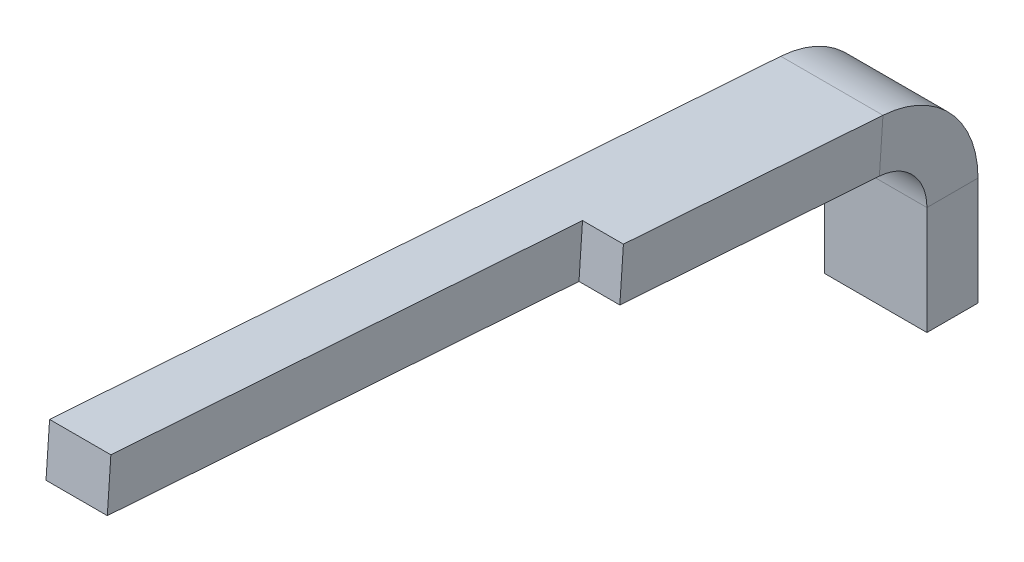
ISO-10303-21;
HEADER;
FILE_DESCRIPTION(('STEP AP214'),'2;1');
FILE_NAME('part.step','',(''),(''),'','','');
FILE_SCHEMA(('AUTOMOTIVE_DESIGN { 1 0 10303 214 1 1 1 1 }'));
ENDSEC;
DATA;
#1=APPLICATION_CONTEXT('core data for automotive mechanical design processes');
#2=APPLICATION_PROTOCOL_DEFINITION('international standard','automotive_design',2000,#1);
#3=PRODUCT_CONTEXT('',#1,'mechanical');
#4=PRODUCT('Part','Part','',(#3));
#5=PRODUCT_RELATED_PRODUCT_CATEGORY('part','',(#4));
#6=PRODUCT_DEFINITION_FORMATION('','',#4);
#7=PRODUCT_DEFINITION_CONTEXT('part definition',#1,'design');
#8=PRODUCT_DEFINITION('design','',#6,#7);
#9=PRODUCT_DEFINITION_SHAPE('','',#8);
#10=(LENGTH_UNIT() NAMED_UNIT(*) SI_UNIT(.MILLI.,.METRE.));
#11=(NAMED_UNIT(*) PLANE_ANGLE_UNIT() SI_UNIT($,.RADIAN.));
#12=(NAMED_UNIT(*) SI_UNIT($,.STERADIAN.) SOLID_ANGLE_UNIT());
#13=UNCERTAINTY_MEASURE_WITH_UNIT(LENGTH_MEASURE(1.E-05),#10,'distance_accuracy_value','');
#14=(GEOMETRIC_REPRESENTATION_CONTEXT(3) GLOBAL_UNCERTAINTY_ASSIGNED_CONTEXT((#13)) GLOBAL_UNIT_ASSIGNED_CONTEXT((#10,
#11,#12)) REPRESENTATION_CONTEXT('',''));
#15=CARTESIAN_POINT('',(0.,0.,0.));
#16=DIRECTION('',(0.,0.,1.));
#17=DIRECTION('',(1.,0.,0.));
#18=AXIS2_PLACEMENT_3D('',#15,#16,#17);
#19=CARTESIAN_POINT('',(0.,0.,0.5));
#20=DIRECTION('',(0.,0.,1.));
#21=DIRECTION('',(1.,0.,0.));
#22=AXIS2_PLACEMENT_3D('',#19,#20,#21);
#23=PLANE('',#22);
#24=DIRECTION('',(0.,1.,0.));
#25=VECTOR('',#24,1.);
#26=CARTESIAN_POINT('',(33.6102996083542,0.,0.5));
#27=LINE('',#26,#25);
#28=CARTESIAN_POINT('',(33.6102996083542,20.4586796564352,0.5));
#29=VERTEX_POINT('',#28);
#30=CARTESIAN_POINT('',(33.6102996083542,21.5182796564303,0.5));
#31=VERTEX_POINT('',#30);
#32=EDGE_CURVE('E11',#29,#31,#27,.T.);
#33=ORIENTED_EDGE('',*,*,#32,.F.);
#34=DIRECTION('',(1.,0.,0.));
#35=VECTOR('',#34,1.);
#36=CARTESIAN_POINT('',(0.,20.4586796564352,0.5));
#37=LINE('',#36,#35);
#38=CARTESIAN_POINT('',(34.6102996083542,20.4586796564352,0.5));
#39=VERTEX_POINT('',#38);
#40=EDGE_CURVE('E24',#29,#39,#37,.T.);
#41=ORIENTED_EDGE('',*,*,#40,.T.);
#42=DIRECTION('',(0.,1.,0.));
#43=VECTOR('',#42,1.);
#44=CARTESIAN_POINT('',(34.6102996083542,0.,0.5));
#45=LINE('',#44,#43);
#46=CARTESIAN_POINT('',(34.6102996083542,21.5182796564303,0.5));
#47=VERTEX_POINT('',#46);
#48=EDGE_CURVE('E172',#39,#47,#45,.T.);
#49=ORIENTED_EDGE('',*,*,#48,.T.);
#50=DIRECTION('',(-1.,0.,0.));
#51=VECTOR('',#50,1.);
#52=CARTESIAN_POINT('',(0.,21.5182796564303,0.5));
#53=LINE('',#52,#51);
#54=EDGE_CURVE('E170',#47,#31,#53,.T.);
#55=ORIENTED_EDGE('',*,*,#54,.T.);
#56=EDGE_LOOP('',(#33,#41,#49,#55));
#57=FACE_BOUND('',#56,.T.);
#58=ADVANCED_FACE('F17',(#57),#23,.T.);
#59=CARTESIAN_POINT('',(33.6102996083542,0.,0.5));
#60=DIRECTION('',(-1.,0.,0.));
#61=DIRECTION('',(0.,0.,1.));
#62=AXIS2_PLACEMENT_3D('',#59,#60,#61);
#63=PLANE('',#62);
#64=DIRECTION('',(0.,1.,0.));
#65=VECTOR('',#64,1.);
#66=CARTESIAN_POINT('',(33.6102996083542,0.,0.));
#67=LINE('',#66,#65);
#68=CARTESIAN_POINT('',(33.6102996083542,20.4586796564352,0.));
#69=VERTEX_POINT('',#68);
#70=CARTESIAN_POINT('',(33.6102996083542,21.5182796564303,0.));
#71=VERTEX_POINT('',#70);
#72=EDGE_CURVE('E168',#69,#71,#67,.T.);
#73=ORIENTED_EDGE('',*,*,#72,.F.);
#74=DIRECTION('',(0.,0.,1.));
#75=VECTOR('',#74,1.);
#76=CARTESIAN_POINT('',(33.6102996083542,20.4586796564352,0.5));
#77=LINE('',#76,#75);
#78=EDGE_CURVE('E166',#69,#29,#77,.T.);
#79=ORIENTED_EDGE('',*,*,#78,.T.);
#80=ORIENTED_EDGE('',*,*,#32,.T.);
#81=DIRECTION('',(0.,0.,-1.));
#82=VECTOR('',#81,1.);
#83=CARTESIAN_POINT('',(33.6102996083542,21.5182796564303,0.50000000000015));
#84=LINE('',#83,#82);
#85=EDGE_CURVE('E164',#31,#71,#84,.T.);
#86=ORIENTED_EDGE('',*,*,#85,.T.);
#87=EDGE_LOOP('',(#73,#79,#80,#86));
#88=FACE_BOUND('',#87,.T.);
#89=ADVANCED_FACE('F211',(#88),#63,.T.);
#90=CARTESIAN_POINT('',(0.,0.,0.));
#91=DIRECTION('',(0.,0.,1.));
#92=DIRECTION('',(1.,0.,0.));
#93=AXIS2_PLACEMENT_3D('',#90,#91,#92);
#94=PLANE('',#93);
#95=DIRECTION('',(1.,0.,0.));
#96=VECTOR('',#95,1.);
#97=CARTESIAN_POINT('',(0.,20.4586796564352,0.));
#98=LINE('',#97,#96);
#99=CARTESIAN_POINT('',(34.6102996083542,20.4586796564352,0.));
#100=VERTEX_POINT('',#99);
#101=EDGE_CURVE('E162',#69,#100,#98,.T.);
#102=ORIENTED_EDGE('',*,*,#101,.F.);
#103=ORIENTED_EDGE('',*,*,#72,.T.);
#104=DIRECTION('',(-1.,0.,0.));
#105=VECTOR('',#104,1.);
#106=CARTESIAN_POINT('',(0.,21.5182796564303,0.));
#107=LINE('',#106,#105);
#108=CARTESIAN_POINT('',(34.6102996083542,21.5182796564303,0.));
#109=VERTEX_POINT('',#108);
#110=EDGE_CURVE('E159',#109,#71,#107,.T.);
#111=ORIENTED_EDGE('',*,*,#110,.F.);
#112=DIRECTION('',(0.,1.,0.));
#113=VECTOR('',#112,1.);
#114=CARTESIAN_POINT('',(34.6102996083542,0.,0.));
#115=LINE('',#114,#113);
#116=EDGE_CURVE('E156',#100,#109,#115,.T.);
#117=ORIENTED_EDGE('',*,*,#116,.F.);
#118=EDGE_LOOP('',(#102,#103,#111,#117));
#119=FACE_BOUND('',#118,.T.);
#120=ADVANCED_FACE('F186',(#119),#94,.F.);
#121=CARTESIAN_POINT('',(34.6102996083542,0.,0.5));
#122=DIRECTION('',(-1.,0.,0.));
#123=DIRECTION('',(0.,0.,1.));
#124=AXIS2_PLACEMENT_3D('',#121,#122,#123);
#125=PLANE('',#124);
#126=DIRECTION('',(0.,0.,1.));
#127=VECTOR('',#126,1.);
#128=CARTESIAN_POINT('',(34.6102996083542,20.4586796564352,0.5));
#129=LINE('',#128,#127);
#130=EDGE_CURVE('E153',#100,#39,#129,.T.);
#131=ORIENTED_EDGE('',*,*,#130,.F.);
#132=ORIENTED_EDGE('',*,*,#116,.T.);
#133=DIRECTION('',(0.,0.,-1.));
#134=VECTOR('',#133,1.);
#135=CARTESIAN_POINT('',(34.6102996083542,21.5182796564303,0.50000000000015));
#136=LINE('',#135,#134);
#137=EDGE_CURVE('E150',#47,#109,#136,.T.);
#138=ORIENTED_EDGE('',*,*,#137,.F.);
#139=ORIENTED_EDGE('',*,*,#48,.F.);
#140=EDGE_LOOP('',(#131,#132,#138,#139));
#141=FACE_BOUND('',#140,.T.);
#142=ADVANCED_FACE('F180',(#141),#125,.F.);
#143=CARTESIAN_POINT('',(34.6102996083542,20.4374949025665,-21.6237355734527));
#144=DIRECTION('',(-1.,0.,0.));
#145=DIRECTION('',(0.,-0.997564050259825,0.0697564737441219));
#146=AXIS2_PLACEMENT_3D('',#143,#144,#145);
#147=PLANE('',#146);
#148=DIRECTION('',(0.,0.0697564737441219,0.997564050259824));
#149=VECTOR('',#148,1.);
#150=CARTESIAN_POINT('',(34.6102996083542,20.4374949025665,-21.6237355734527));
#151=LINE('',#150,#149);
#152=CARTESIAN_POINT('',(34.6102996083542,22.0170616815602,0.965121763127939));
#153=VERTEX_POINT('',#152);
#154=CARTESIAN_POINT('',(34.6102996083542,22.1947078866175,3.5055808534239));
#155=VERTEX_POINT('',#154);
#156=EDGE_CURVE('E109',#153,#155,#151,.T.);
#157=ORIENTED_EDGE('',*,*,#156,.F.);
#158=DIRECTION('',(0.,0.997564050259825,-0.069756473744115));
#159=VECTOR('',#158,1.);
#160=CARTESIAN_POINT('',(34.6102996083542,22.0170616815601,0.965121763127949));
#161=LINE('',#160,#159);
#162=CARTESIAN_POINT('',(34.6102996083542,22.5158437066902,0.93024352625588));
#163=VERTEX_POINT('',#162);
#164=EDGE_CURVE('E147',#153,#163,#161,.T.);
#165=ORIENTED_EDGE('',*,*,#164,.T.);
#166=DIRECTION('',(0.,0.0697564737441219,0.997564050259824));
#167=VECTOR('',#166,1.);
#168=CARTESIAN_POINT('',(34.6102996083542,20.9362769276964,-21.6586138103247));
#169=LINE('',#168,#167);
#170=CARTESIAN_POINT('',(34.6102996083542,22.6934899117475,3.4707026165519));
#171=VERTEX_POINT('',#170);
#172=EDGE_CURVE('E145',#163,#171,#169,.T.);
#173=ORIENTED_EDGE('',*,*,#172,.T.);
#174=DIRECTION('',(0.,0.997564050259824,-0.0697564737441219));
#175=VECTOR('',#174,1.);
#176=CARTESIAN_POINT('',(34.6102996083542,22.1947078866175,3.5055808534239));
#177=LINE('',#176,#175);
#178=EDGE_CURVE('E143',#155,#171,#177,.T.);
#179=ORIENTED_EDGE('',*,*,#178,.F.);
#180=EDGE_LOOP('',(#157,#165,#173,#179));
#181=FACE_BOUND('',#180,.T.);
#182=ADVANCED_FACE('F222',(#181),#147,.F.);
#183=CARTESIAN_POINT('',(0.,20.9362769276964,-21.6586138103247));
#184=DIRECTION('',(0.,-0.997564050259825,0.0697564737441219));
#185=DIRECTION('',(1.,0.,0.));
#186=AXIS2_PLACEMENT_3D('',#183,#184,#185);
#187=PLANE('',#186);
#188=ORIENTED_EDGE('',*,*,#172,.F.);
#189=DIRECTION('',(-1.,0.,0.));
#190=VECTOR('',#189,1.);
#191=CARTESIAN_POINT('',(0.,22.5158437066902,0.93024352625588));
#192=LINE('',#191,#190);
#193=CARTESIAN_POINT('',(33.6102996083542,22.5158437066902,0.93024352625588));
#194=VERTEX_POINT('',#193);
#195=EDGE_CURVE('E141',#163,#194,#192,.T.);
#196=ORIENTED_EDGE('',*,*,#195,.T.);
#197=DIRECTION('',(0.,0.0697564737441219,0.997564050259824));
#198=VECTOR('',#197,1.);
#199=CARTESIAN_POINT('',(33.6102996083542,20.9362769276964,-21.6586138103247));
#200=LINE('',#199,#198);
#201=CARTESIAN_POINT('',(33.6102996083542,23.0163228722701,8.0874290416525));
#202=VERTEX_POINT('',#201);
#203=EDGE_CURVE('E139',#194,#202,#200,.T.);
#204=ORIENTED_EDGE('',*,*,#203,.T.);
#205=DIRECTION('',(1.,0.,0.));
#206=VECTOR('',#205,1.);
#207=CARTESIAN_POINT('',(0.,23.0163228722701,8.0874290416525));
#208=LINE('',#207,#206);
#209=CARTESIAN_POINT('',(34.2102996083517,23.0163228722701,8.0874290416525));
#210=VERTEX_POINT('',#209);
#211=EDGE_CURVE('E137',#202,#210,#208,.T.);
#212=ORIENTED_EDGE('',*,*,#211,.T.);
#213=DIRECTION('',(0.,0.0697564737441219,0.997564050259824));
#214=VECTOR('',#213,1.);
#215=CARTESIAN_POINT('',(34.2102996083517,20.9362769276964,-21.6586138103247));
#216=LINE('',#215,#214);
#217=CARTESIAN_POINT('',(34.2102996083517,22.6934899117475,3.4707026165519));
#218=VERTEX_POINT('',#217);
#219=EDGE_CURVE('E135',#218,#210,#216,.T.);
#220=ORIENTED_EDGE('',*,*,#219,.F.);
#221=DIRECTION('',(1.,0.,0.));
#222=VECTOR('',#221,1.);
#223=CARTESIAN_POINT('',(0.,22.6934899117475,3.4707026165519));
#224=LINE('',#223,#222);
#225=EDGE_CURVE('E97',#218,#171,#224,.T.);
#226=ORIENTED_EDGE('',*,*,#225,.T.);
#227=EDGE_LOOP('',(#188,#196,#204,#212,#220,#226));
#228=FACE_BOUND('',#227,.T.);
#229=ADVANCED_FACE('F225',(#228),#187,.F.);
#230=CARTESIAN_POINT('',(0.,22.5175408471402,8.1223072785245));
#231=DIRECTION('',(0.,0.0697564737441219,0.997564050259825));
#232=DIRECTION('',(0.,-0.997564050259825,0.0697564737441219));
#233=AXIS2_PLACEMENT_3D('',#230,#231,#232);
#234=PLANE('',#233);
#235=ORIENTED_EDGE('',*,*,#211,.F.);
#236=DIRECTION('',(0.,0.997564050259824,-0.0697564737441219));
#237=VECTOR('',#236,1.);
#238=CARTESIAN_POINT('',(33.6102996083542,22.5175408471402,8.1223072785245));
#239=LINE('',#238,#237);
#240=CARTESIAN_POINT('',(33.6102996083542,22.5175408471402,8.1223072785245));
#241=VERTEX_POINT('',#240);
#242=EDGE_CURVE('E131',#241,#202,#239,.T.);
#243=ORIENTED_EDGE('',*,*,#242,.F.);
#244=DIRECTION('',(1.,0.,0.));
#245=VECTOR('',#244,1.);
#246=CARTESIAN_POINT('',(0.,22.5175408471402,8.1223072785245));
#247=LINE('',#246,#245);
#248=CARTESIAN_POINT('',(34.2102996083517,22.5175408471402,8.1223072785245));
#249=VERTEX_POINT('',#248);
#250=EDGE_CURVE('E129',#241,#249,#247,.T.);
#251=ORIENTED_EDGE('',*,*,#250,.T.);
#252=DIRECTION('',(0.,0.997564050259824,-0.0697564737441219));
#253=VECTOR('',#252,1.);
#254=CARTESIAN_POINT('',(34.2102996083517,22.5175408471402,8.1223072785245));
#255=LINE('',#254,#253);
#256=EDGE_CURVE('E115',#249,#210,#255,.T.);
#257=ORIENTED_EDGE('',*,*,#256,.T.);
#258=EDGE_LOOP('',(#235,#243,#251,#257));
#259=FACE_BOUND('',#258,.T.);
#260=ADVANCED_FACE('F229',(#259),#234,.T.);
#261=CARTESIAN_POINT('',(33.6102996083542,20.4374949025665,-21.6237355734527));
#262=DIRECTION('',(-1.,0.,0.));
#263=DIRECTION('',(0.,-0.997564050259825,0.0697564737441219));
#264=AXIS2_PLACEMENT_3D('',#261,#262,#263);
#265=PLANE('',#264);
#266=DIRECTION('',(0.,0.997564050259825,-0.069756473744115));
#267=VECTOR('',#266,1.);
#268=CARTESIAN_POINT('',(33.6102996083542,22.0170616815601,0.965121763127949));
#269=LINE('',#268,#267);
#270=CARTESIAN_POINT('',(33.6102996083542,22.0170616815602,0.96512176312794));
#271=VERTEX_POINT('',#270);
#272=EDGE_CURVE('E125',#271,#194,#269,.T.);
#273=ORIENTED_EDGE('',*,*,#272,.F.);
#274=DIRECTION('',(0.,0.0697564737441219,0.997564050259824));
#275=VECTOR('',#274,1.);
#276=CARTESIAN_POINT('',(33.6102996083542,20.4374949025665,-21.6237355734527));
#277=LINE('',#276,#275);
#278=EDGE_CURVE('E101',#271,#241,#277,.T.);
#279=ORIENTED_EDGE('',*,*,#278,.T.);
#280=ORIENTED_EDGE('',*,*,#242,.T.);
#281=ORIENTED_EDGE('',*,*,#203,.F.);
#282=EDGE_LOOP('',(#273,#279,#280,#281));
#283=FACE_BOUND('',#282,.T.);
#284=ADVANCED_FACE('F233',(#283),#265,.T.);
#285=CARTESIAN_POINT('',(0.,22.1947078866175,3.5055808534239));
#286=DIRECTION('',(0.,0.0697564737441219,0.997564050259825));
#287=DIRECTION('',(0.,-0.997564050259825,0.0697564737441219));
#288=AXIS2_PLACEMENT_3D('',#285,#286,#287);
#289=PLANE('',#288);
#290=ORIENTED_EDGE('',*,*,#225,.F.);
#291=DIRECTION('',(0.,0.997564050259824,-0.0697564737441219));
#292=VECTOR('',#291,1.);
#293=CARTESIAN_POINT('',(34.2102996083517,22.1947078866175,3.5055808534239));
#294=LINE('',#293,#292);
#295=CARTESIAN_POINT('',(34.2102996083517,22.1947078866175,3.5055808534239));
#296=VERTEX_POINT('',#295);
#297=EDGE_CURVE('E91',#296,#218,#294,.T.);
#298=ORIENTED_EDGE('',*,*,#297,.F.);
#299=DIRECTION('',(1.,0.,0.));
#300=VECTOR('',#299,1.);
#301=CARTESIAN_POINT('',(0.,22.1947078866175,3.5055808534239));
#302=LINE('',#301,#300);
#303=EDGE_CURVE('E95',#296,#155,#302,.T.);
#304=ORIENTED_EDGE('',*,*,#303,.T.);
#305=ORIENTED_EDGE('',*,*,#178,.T.);
#306=EDGE_LOOP('',(#290,#298,#304,#305));
#307=FACE_BOUND('',#306,.T.);
#308=ADVANCED_FACE('F93',(#307),#289,.T.);
#309=CARTESIAN_POINT('',(34.2102996083517,20.4374949025665,-21.6237355734527));
#310=DIRECTION('',(-1.,0.,0.));
#311=DIRECTION('',(0.,-0.997564050259825,0.0697564737441219));
#312=AXIS2_PLACEMENT_3D('',#309,#310,#311);
#313=PLANE('',#312);
#314=ORIENTED_EDGE('',*,*,#219,.T.);
#315=ORIENTED_EDGE('',*,*,#256,.F.);
#316=DIRECTION('',(0.,0.0697564737441219,0.997564050259824));
#317=VECTOR('',#316,1.);
#318=CARTESIAN_POINT('',(34.2102996083517,20.4374949025665,-21.6237355734527));
#319=LINE('',#318,#317);
#320=EDGE_CURVE('E108',#296,#249,#319,.T.);
#321=ORIENTED_EDGE('',*,*,#320,.F.);
#322=ORIENTED_EDGE('',*,*,#297,.T.);
#323=EDGE_LOOP('',(#314,#315,#321,#322));
#324=FACE_BOUND('',#323,.T.);
#325=ADVANCED_FACE('F113',(#324),#313,.F.);
#326=CARTESIAN_POINT('',(0.,20.4374949025665,-21.6237355734527));
#327=DIRECTION('',(0.,-0.997564050259825,0.0697564737441219));
#328=DIRECTION('',(1.,0.,0.));
#329=AXIS2_PLACEMENT_3D('',#326,#327,#328);
#330=PLANE('',#329);
#331=DIRECTION('',(-1.,0.,0.));
#332=VECTOR('',#331,1.);
#333=CARTESIAN_POINT('',(0.,22.0170616815602,0.965121763127939));
#334=LINE('',#333,#332);
#335=EDGE_CURVE('E116',#153,#271,#334,.T.);
#336=ORIENTED_EDGE('',*,*,#335,.F.);
#337=ORIENTED_EDGE('',*,*,#156,.T.);
#338=ORIENTED_EDGE('',*,*,#303,.F.);
#339=ORIENTED_EDGE('',*,*,#320,.T.);
#340=ORIENTED_EDGE('',*,*,#250,.F.);
#341=ORIENTED_EDGE('',*,*,#278,.F.);
#342=EDGE_LOOP('',(#336,#337,#338,#339,#340,#341));
#343=FACE_BOUND('',#342,.T.);
#344=ADVANCED_FACE('F106',(#343),#330,.T.);
#345=CARTESIAN_POINT('',(34.6102996083542,21.5182796564303,1.));
#346=DIRECTION('',(-1.,0.,0.));
#347=DIRECTION('',(0.,0.,1.));
#348=AXIS2_PLACEMENT_3D('',#345,#346,#347);
#349=PLANE('',#348);
#350=ORIENTED_EDGE('',*,*,#137,.T.);
#351=CARTESIAN_POINT('',(34.6102996083542,21.5182796564303,1.));
#352=DIRECTION('',(1.,0.,0.));
#353=DIRECTION('',(0.,0.,1.));
#354=AXIS2_PLACEMENT_3D('',#351,#352,#353);
#355=CIRCLE('',#354,1.);
#356=EDGE_CURVE('E119',#109,#163,#355,.T.);
#357=ORIENTED_EDGE('',*,*,#356,.T.);
#358=ORIENTED_EDGE('',*,*,#164,.F.);
#359=CARTESIAN_POINT('',(34.6102996083542,21.5182796564303,1.));
#360=DIRECTION('',(1.,0.,0.));
#361=DIRECTION('',(0.,0.,-1.));
#362=AXIS2_PLACEMENT_3D('',#359,#360,#361);
#363=CIRCLE('',#362,0.5);
#364=EDGE_CURVE('E193',#47,#153,#363,.T.);
#365=ORIENTED_EDGE('',*,*,#364,.F.);
#366=EDGE_LOOP('',(#350,#357,#358,#365));
#367=FACE_BOUND('',#366,.T.);
#368=ADVANCED_FACE('F190',(#367),#349,.F.);
#369=CARTESIAN_POINT('',(33.6102996083542,21.5182796564303,1.));
#370=DIRECTION('',(1.,0.,0.));
#371=DIRECTION('',(0.,0.,-1.));
#372=AXIS2_PLACEMENT_3D('',#369,#370,#371);
#373=PLANE('',#372);
#374=ORIENTED_EDGE('',*,*,#272,.T.);
#375=CARTESIAN_POINT('',(33.6102996083542,21.5182796564303,1.));
#376=DIRECTION('',(-1.,0.,0.));
#377=DIRECTION('',(0.,0.,1.));
#378=AXIS2_PLACEMENT_3D('',#375,#376,#377);
#379=CIRCLE('',#378,1.);
#380=EDGE_CURVE('E199',#194,#71,#379,.T.);
#381=ORIENTED_EDGE('',*,*,#380,.T.);
#382=ORIENTED_EDGE('',*,*,#85,.F.);
#383=CARTESIAN_POINT('',(33.6102996083542,21.5182796564303,1.));
#384=DIRECTION('',(-1.,0.,0.));
#385=DIRECTION('',(0.,0.,-1.));
#386=AXIS2_PLACEMENT_3D('',#383,#384,#385);
#387=CIRCLE('',#386,0.5);
#388=EDGE_CURVE('E203',#271,#31,#387,.T.);
#389=ORIENTED_EDGE('',*,*,#388,.F.);
#390=EDGE_LOOP('',(#374,#381,#382,#389));
#391=FACE_BOUND('',#390,.T.);
#392=ADVANCED_FACE('F210',(#391),#373,.F.);
#393=CARTESIAN_POINT('',(35.6968949003766,21.5182796564303,1.));
#394=DIRECTION('',(-1.,0.,0.));
#395=DIRECTION('',(0.,0.,1.));
#396=AXIS2_PLACEMENT_3D('',#393,#394,#395);
#397=CYLINDRICAL_SURFACE('',#396,0.5);
#398=ORIENTED_EDGE('',*,*,#388,.T.);
#399=ORIENTED_EDGE('',*,*,#54,.F.);
#400=ORIENTED_EDGE('',*,*,#364,.T.);
#401=ORIENTED_EDGE('',*,*,#335,.T.);
#402=EDGE_LOOP('',(#398,#399,#400,#401));
#403=FACE_BOUND('',#402,.T.);
#404=ADVANCED_FACE('F207',(#403),#397,.F.);
#405=CARTESIAN_POINT('',(35.6968949003766,21.5182796564303,1.));
#406=DIRECTION('',(-1.,0.,0.));
#407=DIRECTION('',(0.,0.,1.));
#408=AXIS2_PLACEMENT_3D('',#405,#406,#407);
#409=CYLINDRICAL_SURFACE('',#408,1.);
#410=ORIENTED_EDGE('',*,*,#380,.F.);
#411=ORIENTED_EDGE('',*,*,#195,.F.);
#412=ORIENTED_EDGE('',*,*,#356,.F.);
#413=ORIENTED_EDGE('',*,*,#110,.T.);
#414=EDGE_LOOP('',(#410,#411,#412,#413));
#415=FACE_BOUND('',#414,.T.);
#416=ADVANCED_FACE('F197',(#415),#409,.T.);
#417=CARTESIAN_POINT('',(-0.00029960835417188,20.4586796564352,-0.01));
#418=DIRECTION('',(0.,-1.,0.));
#419=DIRECTION('',(0.,0.,-1.));
#420=AXIS2_PLACEMENT_3D('',#417,#418,#419);
#421=PLANE('',#420);
#422=ORIENTED_EDGE('',*,*,#40,.F.);
#423=ORIENTED_EDGE('',*,*,#78,.F.);
#424=ORIENTED_EDGE('',*,*,#101,.T.);
#425=ORIENTED_EDGE('',*,*,#130,.T.);
#426=EDGE_LOOP('',(#422,#423,#424,#425));
#427=FACE_BOUND('',#426,.T.);
#428=ADVANCED_FACE('F182',(#427),#421,.T.);
#429=CLOSED_SHELL('',(#58,#89,#120,#142,#182,#229,#260,#284,#308,#325,#344,#368,#392,#404,#416,#428));
#430=MANIFOLD_SOLID_BREP('B1',#429);
#431=ADVANCED_BREP_SHAPE_REPRESENTATION('',(#18,#430),#14);
#432=SHAPE_DEFINITION_REPRESENTATION(#9,#431);
ENDSEC;
END-ISO-10303-21;
